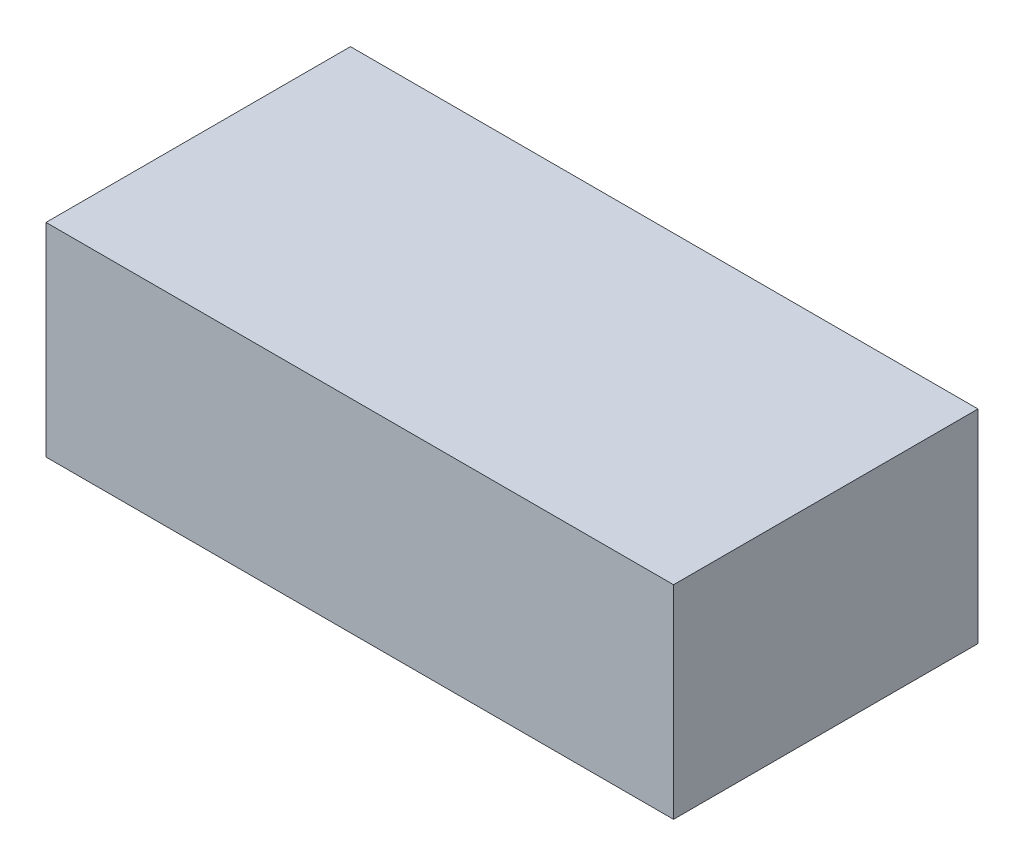
ISO-10303-21;
HEADER;
FILE_DESCRIPTION(('STEP AP214'),'2;1');
FILE_NAME('part.step','',(''),(''),'','','');
FILE_SCHEMA(('AUTOMOTIVE_DESIGN { 1 0 10303 214 1 1 1 1 }'));
ENDSEC;
DATA;
#1=APPLICATION_CONTEXT('core data for automotive mechanical design processes');
#2=APPLICATION_PROTOCOL_DEFINITION('international standard','automotive_design',2000,#1);
#3=PRODUCT_CONTEXT('',#1,'mechanical');
#4=PRODUCT('Part','Part','',(#3));
#5=PRODUCT_RELATED_PRODUCT_CATEGORY('part','',(#4));
#6=PRODUCT_DEFINITION_FORMATION('','',#4);
#7=PRODUCT_DEFINITION_CONTEXT('part definition',#1,'design');
#8=PRODUCT_DEFINITION('design','',#6,#7);
#9=PRODUCT_DEFINITION_SHAPE('','',#8);
#10=(LENGTH_UNIT() NAMED_UNIT(*) SI_UNIT(.MILLI.,.METRE.));
#11=(NAMED_UNIT(*) PLANE_ANGLE_UNIT() SI_UNIT($,.RADIAN.));
#12=(NAMED_UNIT(*) SI_UNIT($,.STERADIAN.) SOLID_ANGLE_UNIT());
#13=UNCERTAINTY_MEASURE_WITH_UNIT(LENGTH_MEASURE(1.E-05),#10,'distance_accuracy_value','');
#14=(GEOMETRIC_REPRESENTATION_CONTEXT(3) GLOBAL_UNCERTAINTY_ASSIGNED_CONTEXT((#13)) GLOBAL_UNIT_ASSIGNED_CONTEXT((#10,
#11,#12)) REPRESENTATION_CONTEXT('',''));
#15=CARTESIAN_POINT('',(0.,0.,0.));
#16=DIRECTION('',(0.,0.,1.));
#17=DIRECTION('',(1.,0.,0.));
#18=AXIS2_PLACEMENT_3D('',#15,#16,#17);
#19=CARTESIAN_POINT('',(24.55,15.9,11.91));
#20=DIRECTION('',(-1.,0.,0.));
#21=DIRECTION('',(0.,0.,1.));
#22=AXIS2_PLACEMENT_3D('',#19,#20,#21);
#23=PLANE('',#22);
#24=DIRECTION('',(0.,0.,-1.));
#25=VECTOR('',#24,1.);
#26=CARTESIAN_POINT('',(24.55,0.,11.91));
#27=LINE('',#26,#25);
#28=CARTESIAN_POINT('',(24.55,0.,11.91));
#29=VERTEX_POINT('',#28);
#30=CARTESIAN_POINT('',(24.55,0.,-11.91));
#31=VERTEX_POINT('',#30);
#32=EDGE_CURVE('E102',#29,#31,#27,.T.);
#33=ORIENTED_EDGE('',*,*,#32,.T.);
#34=DIRECTION('',(0.,-1.,0.));
#35=VECTOR('',#34,1.);
#36=CARTESIAN_POINT('',(24.55,15.9,-11.91));
#37=LINE('',#36,#35);
#38=CARTESIAN_POINT('',(24.55,15.9,-11.91));
#39=VERTEX_POINT('',#38);
#40=EDGE_CURVE('E11',#39,#31,#37,.T.);
#41=ORIENTED_EDGE('',*,*,#40,.F.);
#42=DIRECTION('',(0.,0.,-1.));
#43=VECTOR('',#42,1.);
#44=CARTESIAN_POINT('',(24.55,15.9,11.91));
#45=LINE('',#44,#43);
#46=CARTESIAN_POINT('',(24.55,15.9,11.91));
#47=VERTEX_POINT('',#46);
#48=EDGE_CURVE('E90',#47,#39,#45,.T.);
#49=ORIENTED_EDGE('',*,*,#48,.F.);
#50=DIRECTION('',(0.,-1.,0.));
#51=VECTOR('',#50,1.);
#52=CARTESIAN_POINT('',(24.55,15.9,11.91));
#53=LINE('',#52,#51);
#54=EDGE_CURVE('E98',#47,#29,#53,.T.);
#55=ORIENTED_EDGE('',*,*,#54,.T.);
#56=EDGE_LOOP('',(#33,#41,#49,#55));
#57=FACE_BOUND('',#56,.T.);
#58=ADVANCED_FACE('F39',(#57),#23,.F.);
#59=CARTESIAN_POINT('',(-24.55,15.9,-11.91));
#60=DIRECTION('',(0.,0.,1.));
#61=DIRECTION('',(1.,0.,0.));
#62=AXIS2_PLACEMENT_3D('',#59,#60,#61);
#63=PLANE('',#62);
#64=DIRECTION('',(-1.,0.,0.));
#65=VECTOR('',#64,1.);
#66=CARTESIAN_POINT('',(-24.55,0.,-11.91));
#67=LINE('',#66,#65);
#68=CARTESIAN_POINT('',(-24.55,0.,-11.91));
#69=VERTEX_POINT('',#68);
#70=EDGE_CURVE('E94',#31,#69,#67,.T.);
#71=ORIENTED_EDGE('',*,*,#70,.T.);
#72=DIRECTION('',(0.,-1.,0.));
#73=VECTOR('',#72,1.);
#74=CARTESIAN_POINT('',(-24.55,15.9,-11.91));
#75=LINE('',#74,#73);
#76=CARTESIAN_POINT('',(-24.55,15.9,-11.91));
#77=VERTEX_POINT('',#76);
#78=EDGE_CURVE('E47',#77,#69,#75,.T.);
#79=ORIENTED_EDGE('',*,*,#78,.F.);
#80=DIRECTION('',(-1.,0.,0.));
#81=VECTOR('',#80,1.);
#82=CARTESIAN_POINT('',(-24.55,15.9,-11.91));
#83=LINE('',#82,#81);
#84=EDGE_CURVE('E85',#39,#77,#83,.T.);
#85=ORIENTED_EDGE('',*,*,#84,.F.);
#86=ORIENTED_EDGE('',*,*,#40,.T.);
#87=EDGE_LOOP('',(#71,#79,#85,#86));
#88=FACE_BOUND('',#87,.T.);
#89=ADVANCED_FACE('F93',(#88),#63,.F.);
#90=CARTESIAN_POINT('',(-24.55,15.9,11.91));
#91=DIRECTION('',(1.,0.,0.));
#92=DIRECTION('',(0.,0.,-1.));
#93=AXIS2_PLACEMENT_3D('',#90,#91,#92);
#94=PLANE('',#93);
#95=DIRECTION('',(0.,0.,1.));
#96=VECTOR('',#95,1.);
#97=CARTESIAN_POINT('',(-24.55,0.,11.91));
#98=LINE('',#97,#96);
#99=CARTESIAN_POINT('',(-24.55,0.,11.91));
#100=VERTEX_POINT('',#99);
#101=EDGE_CURVE('E72',#69,#100,#98,.T.);
#102=ORIENTED_EDGE('',*,*,#101,.T.);
#103=DIRECTION('',(0.,-1.,0.));
#104=VECTOR('',#103,1.);
#105=CARTESIAN_POINT('',(-24.55,15.9,11.91));
#106=LINE('',#105,#104);
#107=CARTESIAN_POINT('',(-24.55,15.9,11.91));
#108=VERTEX_POINT('',#107);
#109=EDGE_CURVE('E95',#108,#100,#106,.T.);
#110=ORIENTED_EDGE('',*,*,#109,.F.);
#111=DIRECTION('',(0.,0.,1.));
#112=VECTOR('',#111,1.);
#113=CARTESIAN_POINT('',(-24.55,15.9,11.91));
#114=LINE('',#113,#112);
#115=EDGE_CURVE('E88',#77,#108,#114,.T.);
#116=ORIENTED_EDGE('',*,*,#115,.F.);
#117=ORIENTED_EDGE('',*,*,#78,.T.);
#118=EDGE_LOOP('',(#102,#110,#116,#117));
#119=FACE_BOUND('',#118,.T.);
#120=ADVANCED_FACE('F96',(#119),#94,.F.);
#121=CARTESIAN_POINT('',(-24.55,15.9,11.91));
#122=DIRECTION('',(0.,0.,-1.));
#123=DIRECTION('',(-1.,0.,0.));
#124=AXIS2_PLACEMENT_3D('',#121,#122,#123);
#125=PLANE('',#124);
#126=DIRECTION('',(1.,0.,0.));
#127=VECTOR('',#126,1.);
#128=CARTESIAN_POINT('',(-24.55,0.,11.91));
#129=LINE('',#128,#127);
#130=EDGE_CURVE('E78',#100,#29,#129,.T.);
#131=ORIENTED_EDGE('',*,*,#130,.T.);
#132=ORIENTED_EDGE('',*,*,#54,.F.);
#133=DIRECTION('',(1.,0.,0.));
#134=VECTOR('',#133,1.);
#135=CARTESIAN_POINT('',(-24.55,15.9,11.91));
#136=LINE('',#135,#134);
#137=EDGE_CURVE('E55',#108,#47,#136,.T.);
#138=ORIENTED_EDGE('',*,*,#137,.F.);
#139=ORIENTED_EDGE('',*,*,#109,.T.);
#140=EDGE_LOOP('',(#131,#132,#138,#139));
#141=FACE_BOUND('',#140,.T.);
#142=ADVANCED_FACE('F109',(#141),#125,.F.);
#143=CARTESIAN_POINT('',(0.,15.9,0.));
#144=DIRECTION('',(0.,-1.,0.));
#145=DIRECTION('',(0.,0.,-1.));
#146=AXIS2_PLACEMENT_3D('',#143,#144,#145);
#147=PLANE('',#146);
#148=ORIENTED_EDGE('',*,*,#48,.T.);
#149=ORIENTED_EDGE('',*,*,#84,.T.);
#150=ORIENTED_EDGE('',*,*,#115,.T.);
#151=ORIENTED_EDGE('',*,*,#137,.T.);
#152=EDGE_LOOP('',(#148,#149,#150,#151));
#153=FACE_BOUND('',#152,.T.);
#154=ADVANCED_FACE('F86',(#153),#147,.F.);
#155=CARTESIAN_POINT('',(0.,0.,0.));
#156=DIRECTION('',(0.,-1.,0.));
#157=DIRECTION('',(0.,0.,-1.));
#158=AXIS2_PLACEMENT_3D('',#155,#156,#157);
#159=PLANE('',#158);
#160=ORIENTED_EDGE('',*,*,#32,.F.);
#161=ORIENTED_EDGE('',*,*,#130,.F.);
#162=ORIENTED_EDGE('',*,*,#101,.F.);
#163=ORIENTED_EDGE('',*,*,#70,.F.);
#164=EDGE_LOOP('',(#160,#161,#162,#163));
#165=FACE_BOUND('',#164,.T.);
#166=ADVANCED_FACE('F112',(#165),#159,.T.);
#167=CLOSED_SHELL('',(#58,#89,#120,#142,#154,#166));
#168=MANIFOLD_SOLID_BREP('B2',#167);
#169=ADVANCED_BREP_SHAPE_REPRESENTATION('',(#18,#168),#14);
#170=SHAPE_DEFINITION_REPRESENTATION(#9,#169);
ENDSEC;
END-ISO-10303-21;
